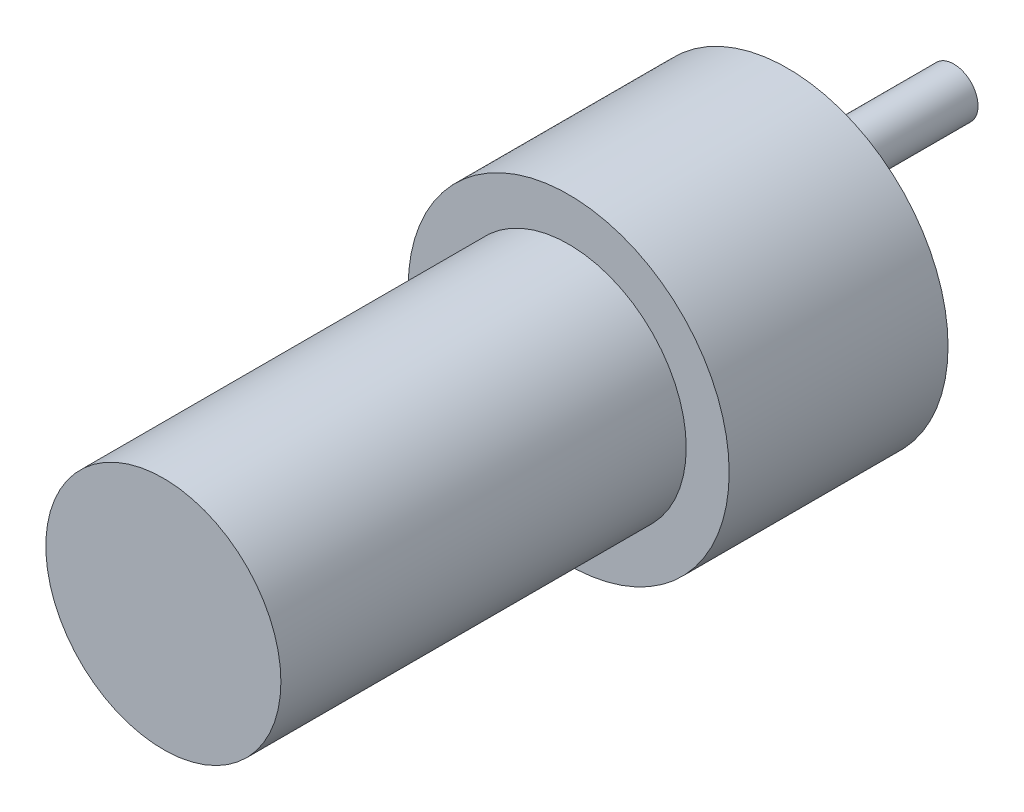
ISO-10303-21;
HEADER;
FILE_DESCRIPTION(('STEP AP214'),'2;1');
FILE_NAME('part.step','',(''),(''),'','','');
FILE_SCHEMA(('AUTOMOTIVE_DESIGN { 1 0 10303 214 1 1 1 1 }'));
ENDSEC;
DATA;
#1=APPLICATION_CONTEXT('core data for automotive mechanical design processes');
#2=APPLICATION_PROTOCOL_DEFINITION('international standard','automotive_design',2000,#1);
#3=PRODUCT_CONTEXT('',#1,'mechanical');
#4=PRODUCT('Part','Part','',(#3));
#5=PRODUCT_RELATED_PRODUCT_CATEGORY('part','',(#4));
#6=PRODUCT_DEFINITION_FORMATION('','',#4);
#7=PRODUCT_DEFINITION_CONTEXT('part definition',#1,'design');
#8=PRODUCT_DEFINITION('design','',#6,#7);
#9=PRODUCT_DEFINITION_SHAPE('','',#8);
#10=(LENGTH_UNIT() NAMED_UNIT(*) SI_UNIT(.MILLI.,.METRE.));
#11=(NAMED_UNIT(*) PLANE_ANGLE_UNIT() SI_UNIT($,.RADIAN.));
#12=(NAMED_UNIT(*) SI_UNIT($,.STERADIAN.) SOLID_ANGLE_UNIT());
#13=UNCERTAINTY_MEASURE_WITH_UNIT(LENGTH_MEASURE(1.E-05),#10,'distance_accuracy_value','');
#14=(GEOMETRIC_REPRESENTATION_CONTEXT(3) GLOBAL_UNCERTAINTY_ASSIGNED_CONTEXT((#13)) GLOBAL_UNIT_ASSIGNED_CONTEXT((#10,
#11,#12)) REPRESENTATION_CONTEXT('',''));
#15=CARTESIAN_POINT('',(0.,0.,0.));
#16=DIRECTION('',(0.,0.,1.));
#17=DIRECTION('',(1.,0.,0.));
#18=AXIS2_PLACEMENT_3D('',#15,#16,#17);
#19=CARTESIAN_POINT('',(0.,7.,-5.5));
#20=DIRECTION('',(0.,0.,-1.));
#21=DIRECTION('',(-1.,0.,0.));
#22=AXIS2_PLACEMENT_3D('',#19,#20,#21);
#23=PLANE('',#22);
#24=CARTESIAN_POINT('',(0.,7.,-5.5));
#25=DIRECTION('',(0.,0.,-1.));
#26=DIRECTION('',(-1.,0.,0.));
#27=AXIS2_PLACEMENT_3D('',#24,#25,#26);
#28=CIRCLE('',#27,6.);
#29=CARTESIAN_POINT('',(-6.,7.,-5.5));
#30=VERTEX_POINT('',#29);
#31=EDGE_CURVE('E70',#30,#30,#28,.T.);
#32=ORIENTED_EDGE('',*,*,#31,.T.);
#33=EDGE_LOOP('',(#32));
#34=FACE_BOUND('',#33,.T.);
#35=CARTESIAN_POINT('',(0.,7.,-5.5));
#36=DIRECTION('',(0.,0.,-1.));
#37=DIRECTION('',(-1.,0.,0.));
#38=AXIS2_PLACEMENT_3D('',#35,#36,#37);
#39=CIRCLE('',#38,3.);
#40=CARTESIAN_POINT('',(-3.,7.,-5.5));
#41=VERTEX_POINT('',#40);
#42=EDGE_CURVE('E76',#41,#41,#39,.T.);
#43=ORIENTED_EDGE('',*,*,#42,.F.);
#44=EDGE_LOOP('',(#43));
#45=FACE_BOUND('',#44,.T.);
#46=ADVANCED_FACE('F31',(#34,#45),#23,.T.);
#47=CARTESIAN_POINT('',(0.,0.,0.));
#48=DIRECTION('',(0.,0.,1.));
#49=DIRECTION('',(1.,0.,0.));
#50=AXIS2_PLACEMENT_3D('',#47,#48,#49);
#51=PLANE('',#50);
#52=CARTESIAN_POINT('',(0.,0.,0.));
#53=DIRECTION('',(0.,0.,1.));
#54=DIRECTION('',(1.,0.,0.));
#55=AXIS2_PLACEMENT_3D('',#52,#53,#54);
#56=CIRCLE('',#55,19.8);
#57=CARTESIAN_POINT('',(19.8,0.,0.));
#58=VERTEX_POINT('',#57);
#59=EDGE_CURVE('E42',#58,#58,#56,.T.);
#60=ORIENTED_EDGE('',*,*,#59,.F.);
#61=EDGE_LOOP('',(#60));
#62=FACE_BOUND('',#61,.T.);
#63=CARTESIAN_POINT('',(15.5,0.,0.));
#64=DIRECTION('',(0.,0.,-1.));
#65=DIRECTION('',(-1.,0.,0.));
#66=AXIS2_PLACEMENT_3D('',#63,#64,#65);
#67=CIRCLE('',#66,1.6);
#68=CARTESIAN_POINT('',(13.9,0.,0.));
#69=VERTEX_POINT('',#68);
#70=EDGE_CURVE('E55',#69,#69,#67,.T.);
#71=ORIENTED_EDGE('',*,*,#70,.F.);
#72=EDGE_LOOP('',(#71));
#73=FACE_BOUND('',#72,.T.);
#74=CARTESIAN_POINT('',(-7.74999999999997,13.4233937586588,0.));
#75=DIRECTION('',(0.,0.,-1.));
#76=DIRECTION('',(-1.,0.,0.));
#77=AXIS2_PLACEMENT_3D('',#74,#75,#76);
#78=CIRCLE('',#77,1.6);
#79=CARTESIAN_POINT('',(-9.34999999999997,13.4233937586588,0.));
#80=VERTEX_POINT('',#79);
#81=EDGE_CURVE('E61',#80,#80,#78,.T.);
#82=ORIENTED_EDGE('',*,*,#81,.F.);
#83=EDGE_LOOP('',(#82));
#84=FACE_BOUND('',#83,.T.);
#85=CARTESIAN_POINT('',(-7.74999999999997,-13.4233937586588,0.));
#86=DIRECTION('',(0.,0.,-1.));
#87=DIRECTION('',(-1.,0.,0.));
#88=AXIS2_PLACEMENT_3D('',#85,#86,#87);
#89=CIRCLE('',#88,1.6);
#90=CARTESIAN_POINT('',(-9.34999999999997,-13.4233937586588,0.));
#91=VERTEX_POINT('',#90);
#92=EDGE_CURVE('E67',#91,#91,#89,.T.);
#93=ORIENTED_EDGE('',*,*,#92,.F.);
#94=EDGE_LOOP('',(#93));
#95=FACE_BOUND('',#94,.T.);
#96=CARTESIAN_POINT('',(0.,7.,0.));
#97=DIRECTION('',(0.,0.,1.));
#98=DIRECTION('',(1.,0.,0.));
#99=AXIS2_PLACEMENT_3D('',#96,#97,#98);
#100=CIRCLE('',#99,6.);
#101=CARTESIAN_POINT('',(6.,7.,0.));
#102=VERTEX_POINT('',#101);
#103=EDGE_CURVE('E10',#102,#102,#100,.F.);
#104=ORIENTED_EDGE('',*,*,#103,.F.);
#105=EDGE_LOOP('',(#104));
#106=FACE_BOUND('',#105,.T.);
#107=ADVANCED_FACE('F92',(#62,#73,#84,#95,#106),#51,.F.);
#108=CARTESIAN_POINT('',(0.,0.,27.));
#109=DIRECTION('',(0.,0.,1.));
#110=DIRECTION('',(1.,0.,0.));
#111=AXIS2_PLACEMENT_3D('',#108,#109,#110);
#112=PLANE('',#111);
#113=CARTESIAN_POINT('',(0.,0.,27.));
#114=DIRECTION('',(0.,0.,1.));
#115=DIRECTION('',(1.,0.,0.));
#116=AXIS2_PLACEMENT_3D('',#113,#114,#115);
#117=CIRCLE('',#116,19.8);
#118=CARTESIAN_POINT('',(19.8,0.,27.));
#119=VERTEX_POINT('',#118);
#120=EDGE_CURVE('E38',#119,#119,#117,.T.);
#121=ORIENTED_EDGE('',*,*,#120,.T.);
#122=EDGE_LOOP('',(#121));
#123=FACE_BOUND('',#122,.T.);
#124=CARTESIAN_POINT('',(0.,0.,27.));
#125=DIRECTION('',(0.,0.,1.));
#126=DIRECTION('',(1.,0.,0.));
#127=AXIS2_PLACEMENT_3D('',#124,#125,#126);
#128=CIRCLE('',#127,14.5);
#129=CARTESIAN_POINT('',(14.5,0.,27.));
#130=VERTEX_POINT('',#129);
#131=EDGE_CURVE('E49',#130,#130,#128,.T.);
#132=ORIENTED_EDGE('',*,*,#131,.F.);
#133=EDGE_LOOP('',(#132));
#134=FACE_BOUND('',#133,.T.);
#135=ADVANCED_FACE('F98',(#123,#134),#112,.T.);
#136=CARTESIAN_POINT('',(0.,0.,27.));
#137=DIRECTION('',(0.,0.,-1.));
#138=DIRECTION('',(-1.,0.,0.));
#139=AXIS2_PLACEMENT_3D('',#136,#137,#138);
#140=CYLINDRICAL_SURFACE('',#139,19.8);
#141=ORIENTED_EDGE('',*,*,#120,.F.);
#142=EDGE_LOOP('',(#141));
#143=FACE_BOUND('',#142,.T.);
#144=ORIENTED_EDGE('',*,*,#59,.T.);
#145=EDGE_LOOP('',(#144));
#146=FACE_BOUND('',#145,.T.);
#147=ADVANCED_FACE('F33',(#143,#146),#140,.T.);
#148=CARTESIAN_POINT('',(0.,0.,77.));
#149=DIRECTION('',(0.,0.,-1.));
#150=DIRECTION('',(-1.,0.,0.));
#151=AXIS2_PLACEMENT_3D('',#148,#149,#150);
#152=CYLINDRICAL_SURFACE('',#151,14.5);
#153=CARTESIAN_POINT('',(0.,0.,77.));
#154=DIRECTION('',(0.,0.,1.));
#155=DIRECTION('',(1.,0.,0.));
#156=AXIS2_PLACEMENT_3D('',#153,#154,#155);
#157=CIRCLE('',#156,14.5);
#158=CARTESIAN_POINT('',(14.5,0.,77.));
#159=VERTEX_POINT('',#158);
#160=EDGE_CURVE('E47',#159,#159,#157,.T.);
#161=ORIENTED_EDGE('',*,*,#160,.F.);
#162=EDGE_LOOP('',(#161));
#163=FACE_BOUND('',#162,.T.);
#164=ORIENTED_EDGE('',*,*,#131,.T.);
#165=EDGE_LOOP('',(#164));
#166=FACE_BOUND('',#165,.T.);
#167=ADVANCED_FACE('F132',(#163,#166),#152,.T.);
#168=CARTESIAN_POINT('',(0.,0.,77.));
#169=DIRECTION('',(0.,0.,1.));
#170=DIRECTION('',(1.,0.,0.));
#171=AXIS2_PLACEMENT_3D('',#168,#169,#170);
#172=PLANE('',#171);
#173=ORIENTED_EDGE('',*,*,#160,.T.);
#174=EDGE_LOOP('',(#173));
#175=FACE_BOUND('',#174,.T.);
#176=ADVANCED_FACE('F128',(#175),#172,.T.);
#177=CARTESIAN_POINT('',(15.5,0.,10.));
#178=DIRECTION('',(0.,0.,-1.));
#179=DIRECTION('',(-1.,0.,0.));
#180=AXIS2_PLACEMENT_3D('',#177,#178,#179);
#181=CYLINDRICAL_SURFACE('',#180,1.6);
#182=CARTESIAN_POINT('',(15.5,0.,10.));
#183=DIRECTION('',(0.,0.,-1.));
#184=DIRECTION('',(-1.,0.,0.));
#185=AXIS2_PLACEMENT_3D('',#182,#183,#184);
#186=CIRCLE('',#185,1.6);
#187=CARTESIAN_POINT('',(13.9,0.,10.));
#188=VERTEX_POINT('',#187);
#189=EDGE_CURVE('E52',#188,#188,#186,.T.);
#190=ORIENTED_EDGE('',*,*,#189,.F.);
#191=EDGE_LOOP('',(#190));
#192=FACE_BOUND('',#191,.T.);
#193=ORIENTED_EDGE('',*,*,#70,.T.);
#194=EDGE_LOOP('',(#193));
#195=FACE_BOUND('',#194,.T.);
#196=ADVANCED_FACE('F124',(#192,#195),#181,.F.);
#197=CARTESIAN_POINT('',(15.5,0.,10.));
#198=DIRECTION('',(0.,0.,-1.));
#199=DIRECTION('',(-1.,0.,0.));
#200=AXIS2_PLACEMENT_3D('',#197,#198,#199);
#201=PLANE('',#200);
#202=ORIENTED_EDGE('',*,*,#189,.T.);
#203=EDGE_LOOP('',(#202));
#204=FACE_BOUND('',#203,.T.);
#205=ADVANCED_FACE('F120',(#204),#201,.T.);
#206=CARTESIAN_POINT('',(-7.74999999999997,13.4233937586588,10.));
#207=DIRECTION('',(0.,0.,-1.));
#208=DIRECTION('',(-1.,0.,0.));
#209=AXIS2_PLACEMENT_3D('',#206,#207,#208);
#210=CYLINDRICAL_SURFACE('',#209,1.6);
#211=CARTESIAN_POINT('',(-7.74999999999997,13.4233937586588,10.));
#212=DIRECTION('',(0.,0.,-1.));
#213=DIRECTION('',(-1.,0.,0.));
#214=AXIS2_PLACEMENT_3D('',#211,#212,#213);
#215=CIRCLE('',#214,1.6);
#216=CARTESIAN_POINT('',(-9.34999999999997,13.4233937586588,10.));
#217=VERTEX_POINT('',#216);
#218=EDGE_CURVE('E58',#217,#217,#215,.T.);
#219=ORIENTED_EDGE('',*,*,#218,.F.);
#220=EDGE_LOOP('',(#219));
#221=FACE_BOUND('',#220,.T.);
#222=ORIENTED_EDGE('',*,*,#81,.T.);
#223=EDGE_LOOP('',(#222));
#224=FACE_BOUND('',#223,.T.);
#225=ADVANCED_FACE('F116',(#221,#224),#210,.F.);
#226=CARTESIAN_POINT('',(-7.74999999999997,13.4233937586588,10.));
#227=DIRECTION('',(0.,0.,-1.));
#228=DIRECTION('',(-1.,0.,0.));
#229=AXIS2_PLACEMENT_3D('',#226,#227,#228);
#230=PLANE('',#229);
#231=ORIENTED_EDGE('',*,*,#218,.T.);
#232=EDGE_LOOP('',(#231));
#233=FACE_BOUND('',#232,.T.);
#234=ADVANCED_FACE('F112',(#233),#230,.T.);
#235=CARTESIAN_POINT('',(-7.74999999999997,-13.4233937586588,10.));
#236=DIRECTION('',(0.,0.,-1.));
#237=DIRECTION('',(-1.,0.,0.));
#238=AXIS2_PLACEMENT_3D('',#235,#236,#237);
#239=CYLINDRICAL_SURFACE('',#238,1.6);
#240=CARTESIAN_POINT('',(-7.74999999999997,-13.4233937586588,10.));
#241=DIRECTION('',(0.,0.,-1.));
#242=DIRECTION('',(-1.,0.,0.));
#243=AXIS2_PLACEMENT_3D('',#240,#241,#242);
#244=CIRCLE('',#243,1.6);
#245=CARTESIAN_POINT('',(-9.34999999999997,-13.4233937586588,10.));
#246=VERTEX_POINT('',#245);
#247=EDGE_CURVE('E64',#246,#246,#244,.T.);
#248=ORIENTED_EDGE('',*,*,#247,.F.);
#249=EDGE_LOOP('',(#248));
#250=FACE_BOUND('',#249,.T.);
#251=ORIENTED_EDGE('',*,*,#92,.T.);
#252=EDGE_LOOP('',(#251));
#253=FACE_BOUND('',#252,.T.);
#254=ADVANCED_FACE('F108',(#250,#253),#239,.F.);
#255=CARTESIAN_POINT('',(-7.74999999999997,-13.4233937586588,10.));
#256=DIRECTION('',(0.,0.,-1.));
#257=DIRECTION('',(-1.,0.,0.));
#258=AXIS2_PLACEMENT_3D('',#255,#256,#257);
#259=PLANE('',#258);
#260=ORIENTED_EDGE('',*,*,#247,.T.);
#261=EDGE_LOOP('',(#260));
#262=FACE_BOUND('',#261,.T.);
#263=ADVANCED_FACE('F104',(#262),#259,.T.);
#264=CARTESIAN_POINT('',(0.,7.,-5.5));
#265=DIRECTION('',(0.,0.,1.));
#266=DIRECTION('',(1.,0.,0.));
#267=AXIS2_PLACEMENT_3D('',#264,#265,#266);
#268=CYLINDRICAL_SURFACE('',#267,6.);
#269=ORIENTED_EDGE('',*,*,#31,.F.);
#270=EDGE_LOOP('',(#269));
#271=FACE_BOUND('',#270,.T.);
#272=ORIENTED_EDGE('',*,*,#103,.T.);
#273=EDGE_LOOP('',(#272));
#274=FACE_BOUND('',#273,.T.);
#275=ADVANCED_FACE('F87',(#271,#274),#268,.T.);
#276=CARTESIAN_POINT('',(0.,7.,-20.5));
#277=DIRECTION('',(0.,0.,1.));
#278=DIRECTION('',(1.,0.,0.));
#279=AXIS2_PLACEMENT_3D('',#276,#277,#278);
#280=CYLINDRICAL_SURFACE('',#279,3.);
#281=CARTESIAN_POINT('',(0.,7.,-20.5));
#282=DIRECTION('',(0.,0.,-1.));
#283=DIRECTION('',(-1.,0.,0.));
#284=AXIS2_PLACEMENT_3D('',#281,#282,#283);
#285=CIRCLE('',#284,3.);
#286=CARTESIAN_POINT('',(-3.,7.,-20.5));
#287=VERTEX_POINT('',#286);
#288=EDGE_CURVE('E75',#287,#287,#285,.T.);
#289=ORIENTED_EDGE('',*,*,#288,.F.);
#290=EDGE_LOOP('',(#289));
#291=FACE_BOUND('',#290,.T.);
#292=ORIENTED_EDGE('',*,*,#42,.T.);
#293=EDGE_LOOP('',(#292));
#294=FACE_BOUND('',#293,.T.);
#295=ADVANCED_FACE('F84',(#291,#294),#280,.T.);
#296=CARTESIAN_POINT('',(0.,7.,-20.5));
#297=DIRECTION('',(0.,0.,-1.));
#298=DIRECTION('',(-1.,0.,0.));
#299=AXIS2_PLACEMENT_3D('',#296,#297,#298);
#300=PLANE('',#299);
#301=ORIENTED_EDGE('',*,*,#288,.T.);
#302=EDGE_LOOP('',(#301));
#303=FACE_BOUND('',#302,.T.);
#304=ADVANCED_FACE('F82',(#303),#300,.T.);
#305=CLOSED_SHELL('',(#46,#107,#135,#147,#167,#176,#196,#205,#225,#234,#254,#263,#275,#295,#304));
#306=MANIFOLD_SOLID_BREP('B2',#305);
#307=ADVANCED_BREP_SHAPE_REPRESENTATION('',(#18,#306),#14);
#308=SHAPE_DEFINITION_REPRESENTATION(#9,#307);
ENDSEC;
END-ISO-10303-21;
